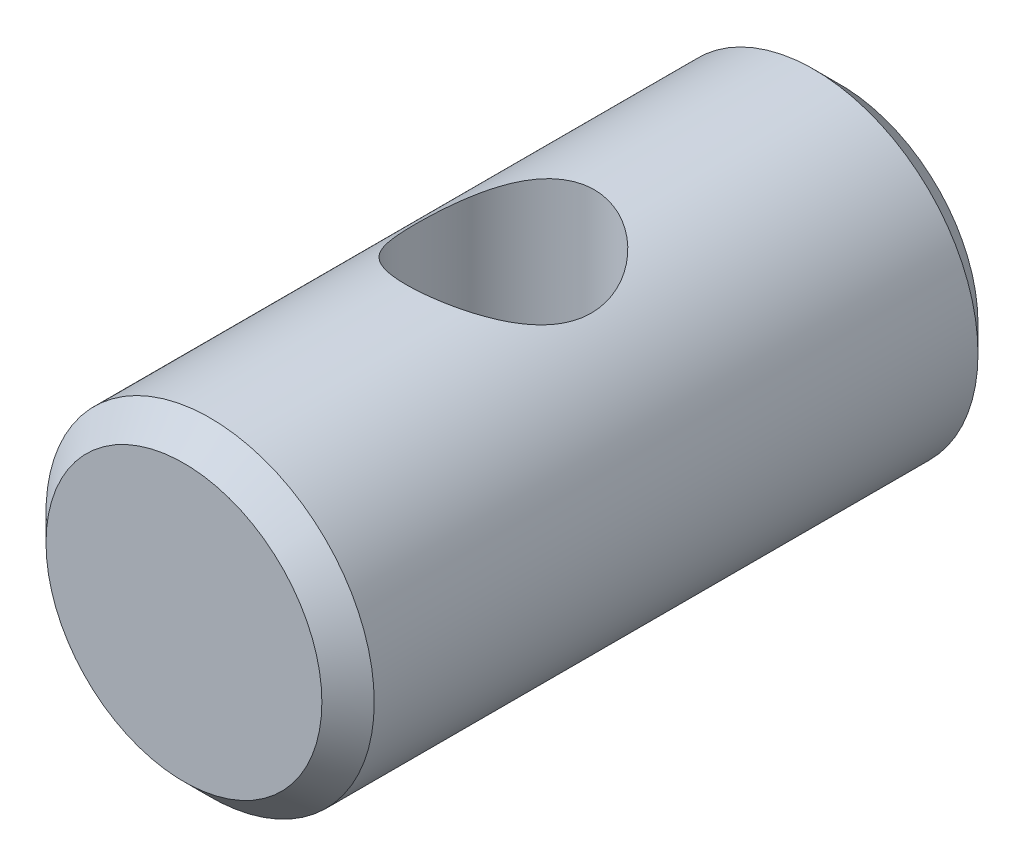
ISO-10303-21;
HEADER;
FILE_DESCRIPTION(('STEP AP214'),'2;1');
FILE_NAME('part.step','',(''),(''),'','','');
FILE_SCHEMA(('AUTOMOTIVE_DESIGN { 1 0 10303 214 1 1 1 1 }'));
ENDSEC;
DATA;
#1=APPLICATION_CONTEXT('core data for automotive mechanical design processes');
#2=APPLICATION_PROTOCOL_DEFINITION('international standard','automotive_design',2000,#1);
#3=PRODUCT_CONTEXT('',#1,'mechanical');
#4=PRODUCT('Part','Part','',(#3));
#5=PRODUCT_RELATED_PRODUCT_CATEGORY('part','',(#4));
#6=PRODUCT_DEFINITION_FORMATION('','',#4);
#7=PRODUCT_DEFINITION_CONTEXT('part definition',#1,'design');
#8=PRODUCT_DEFINITION('design','',#6,#7);
#9=PRODUCT_DEFINITION_SHAPE('','',#8);
#10=(LENGTH_UNIT() NAMED_UNIT(*) SI_UNIT(.MILLI.,.METRE.));
#11=(NAMED_UNIT(*) PLANE_ANGLE_UNIT() SI_UNIT($,.RADIAN.));
#12=(NAMED_UNIT(*) SI_UNIT($,.STERADIAN.) SOLID_ANGLE_UNIT());
#13=UNCERTAINTY_MEASURE_WITH_UNIT(LENGTH_MEASURE(1.E-05),#10,'distance_accuracy_value','');
#14=(GEOMETRIC_REPRESENTATION_CONTEXT(3) GLOBAL_UNCERTAINTY_ASSIGNED_CONTEXT((#13)) GLOBAL_UNIT_ASSIGNED_CONTEXT((#10,
#11,#12)) REPRESENTATION_CONTEXT('',''));
#15=CARTESIAN_POINT('',(0.,0.,0.));
#16=DIRECTION('',(0.,0.,1.));
#17=DIRECTION('',(1.,0.,0.));
#18=AXIS2_PLACEMENT_3D('',#15,#16,#17);
#19=CARTESIAN_POINT('',(0.,0.,9.525));
#20=DIRECTION('',(0.,0.,-1.));
#21=DIRECTION('',(-1.,0.,0.));
#22=AXIS2_PLACEMENT_3D('',#19,#20,#21);
#23=CYLINDRICAL_SURFACE('',#22,4.765);
#24=CARTESIAN_POINT('',(0.,-4.765,-2.54273966422046));
#25=CARTESIAN_POINT('',(-0.131234162810196,-4.76499632502414,-2.55563858615669));
#26=CARTESIAN_POINT('',(-0.263508875387824,-4.75952804002792,-2.55833983860571));
#27=CARTESIAN_POINT('',(-0.526026721694798,-4.73771016732301,-2.54345094110737));
#28=CARTESIAN_POINT('',(-0.656268752678808,-4.7213548698996,-2.52585014015741));
#29=CARTESIAN_POINT('',(-0.910558488777227,-4.67896174619539,-2.47154715768307));
#30=CARTESIAN_POINT('',(-1.0346247978077,-4.65295528293233,-2.43490669591046));
#31=CARTESIAN_POINT('',(-1.2741756527519,-4.59314338018976,-2.34425023151949));
#32=CARTESIAN_POINT('',(-1.38965862622015,-4.55933651632967,-2.29023105477541));
#33=CARTESIAN_POINT('',(-1.61667014870217,-4.48405534141557,-2.16291105056823));
#34=CARTESIAN_POINT('',(-1.72754276873011,-4.44224209691054,-2.08864569511591));
#35=CARTESIAN_POINT('',(-1.93579371588697,-4.3555340907485,-1.92450796803898));
#36=CARTESIAN_POINT('',(-2.03315940991598,-4.31063650218239,-1.83462116021945));
#37=CARTESIAN_POINT('',(-2.22384777330615,-4.215730489479,-1.62908413718988));
#38=CARTESIAN_POINT('',(-2.31525852917362,-4.16576041150536,-1.51163299377078));
#39=CARTESIAN_POINT('',(-2.47712992918034,-4.07158824215013,-1.26100138228972));
#40=CARTESIAN_POINT('',(-2.54760693767323,-4.02738166057037,-1.12783331488505));
#41=CARTESIAN_POINT('',(-2.65318474211665,-3.9584088780149,-0.87605484010196));
#42=CARTESIAN_POINT('',(-2.69253260643925,-3.93152513092531,-0.759811434548258));
#43=CARTESIAN_POINT('',(-2.75433251261748,-3.88848511948111,-0.521057643325844));
#44=CARTESIAN_POINT('',(-2.77680672770738,-3.87231478020774,-0.398555708854987));
#45=CARTESIAN_POINT('',(-2.80367066797346,-3.85291481090373,-0.149941913344977));
#46=CARTESIAN_POINT('',(-2.80797623517439,-3.84974540364682,-0.0238159718505973));
#47=CARTESIAN_POINT('',(-2.79797010239369,-3.85702211954356,0.227315359086184));
#48=CARTESIAN_POINT('',(-2.78365330360741,-3.86747197165258,0.352320432197594));
#49=CARTESIAN_POINT('',(-2.73891068281778,-3.89926448698678,0.588964880899587));
#50=CARTESIAN_POINT('',(-2.70963978394585,-3.91982268222749,0.700936430756225));
#51=CARTESIAN_POINT('',(-2.63702474820962,-3.96903518064436,0.918305034517872));
#52=CARTESIAN_POINT('',(-2.59367537128443,-3.99769249782704,1.02369962301395));
#53=CARTESIAN_POINT('',(-2.48804168009262,-4.06438550992604,1.23907885058188));
#54=CARTESIAN_POINT('',(-2.4240754869965,-4.10314362376342,1.34801082677383));
#55=CARTESIAN_POINT('',(-2.28157130333465,-4.18406267879159,1.55451137031308));
#56=CARTESIAN_POINT('',(-2.20302231602904,-4.22622617430036,1.65207127110964));
#57=CARTESIAN_POINT('',(-2.01792763899043,-4.31805508413361,1.85036906609927));
#58=CARTESIAN_POINT('',(-1.90889067692406,-4.36776601787844,1.94877845711763));
#59=CARTESIAN_POINT('',(-1.67433379772052,-4.46294190336347,2.12624630795825));
#60=CARTESIAN_POINT('',(-1.54880911191897,-4.50840562016684,2.20529915036132));
#61=CARTESIAN_POINT('',(-1.28211451393215,-4.59141709314619,2.34210643095331));
#62=CARTESIAN_POINT('',(-1.14077935681848,-4.62886644765454,2.39960198698727));
#63=CARTESIAN_POINT('',(-0.847649194485303,-4.69138312631982,2.48882113504679));
#64=CARTESIAN_POINT('',(-0.69586717545074,-4.71646551765715,2.52057611841751));
#65=CARTESIAN_POINT('',(-0.40617897189008,-4.74961816322524,2.55386882592492));
#66=CARTESIAN_POINT('',(-0.268831766884244,-4.75938713260981,2.558613321697));
#67=CARTESIAN_POINT('',(0.00514878225355242,-4.76696428347758,2.54591939769328));
#68=CARTESIAN_POINT('',(0.14178235351875,-4.764776536239,2.52848853020959));
#69=CARTESIAN_POINT('',(0.400084379431176,-4.7498106063684,2.47418155682139));
#70=CARTESIAN_POINT('',(0.52211998541907,-4.73781091642973,2.4388052135991));
#71=CARTESIAN_POINT('',(0.758670403551588,-4.70573057938552,2.35085924151378));
#72=CARTESIAN_POINT('',(0.873184171932456,-4.68564881351903,2.29828723253035));
#73=CARTESIAN_POINT('',(1.09791688037624,-4.63828244841571,2.17449724800048));
#74=CARTESIAN_POINT('',(1.20761879618655,-4.61068269292564,2.10246495346889));
#75=CARTESIAN_POINT('',(1.41413807750308,-4.55159272957087,1.94311708671047));
#76=CARTESIAN_POINT('',(1.51094792437732,-4.52010027195177,1.85579266426418));
#77=CARTESIAN_POINT('',(1.69928989061669,-4.45293534574244,1.6579535778627));
#78=CARTESIAN_POINT('',(1.78925876685605,-4.41716576274987,1.54597828309691));
#79=CARTESIAN_POINT('',(1.94959707604509,-4.3487829593985,1.30782639571371));
#80=CARTESIAN_POINT('',(2.01995981269805,-4.31617081991098,1.18164497173222));
#81=CARTESIAN_POINT('',(2.14004270510666,-4.2579344769261,0.915134343662928));
#82=CARTESIAN_POINT('',(2.18933842475008,-4.23245722646518,0.774579158295589));
#83=CARTESIAN_POINT('',(2.26285770076865,-4.19362427692555,0.485521517103191));
#84=CARTESIAN_POINT('',(2.28711561200449,-4.18025197152633,0.337030245768311));
#85=CARTESIAN_POINT('',(2.30791655783512,-4.1687950418939,0.0541461069359638));
#86=CARTESIAN_POINT('',(2.30723302883259,-4.16918047029109,-0.079985524621833));
#87=CARTESIAN_POINT('',(2.28498302399738,-4.18141542004355,-0.345967138086162));
#88=CARTESIAN_POINT('',(2.26341531186645,-4.19326562008835,-0.477816984445627));
#89=CARTESIAN_POINT('',(2.20202919035762,-4.22580271307766,-0.729038499438524));
#90=CARTESIAN_POINT('',(2.16315308305691,-4.24603000472168,-0.848705104752036));
#91=CARTESIAN_POINT('',(2.0688807322471,-4.29275151137972,-1.08001363539453));
#92=CARTESIAN_POINT('',(2.01347917760682,-4.31924774060724,-1.19165296649177));
#93=CARTESIAN_POINT('',(1.88122278738037,-4.37858200533904,-1.4158075340892));
#94=CARTESIAN_POINT('',(1.80277105005214,-4.41178981482293,-1.52728234295355));
#95=CARTESIAN_POINT('',(1.62924713419758,-4.47877547679348,-1.73635566067325));
#96=CARTESIAN_POINT('',(1.53416248453246,-4.51255373970693,-1.83394365710203));
#97=CARTESIAN_POINT('',(1.32032828765552,-4.57990821684137,-2.02087476584663));
#98=CARTESIAN_POINT('',(1.20025244925115,-4.6132218068865,-2.10880613438957));
#99=CARTESIAN_POINT('',(0.945299700362144,-4.67211643000784,-2.26305319257858));
#100=CARTESIAN_POINT('',(0.810441721310551,-4.6977071995246,-2.32939610790794));
#101=CARTESIAN_POINT('',(0.563277855797107,-4.73282391344763,-2.42481780969898));
#102=CARTESIAN_POINT('',(0.453263645921081,-4.74472559578174,-2.45901026584623));
#103=CARTESIAN_POINT('',(0.229098138083577,-4.76081396835667,-2.51231959839029));
#104=CARTESIAN_POINT('',(0.114948225900611,-4.76500321891759,-2.53144147660795));
#105=CARTESIAN_POINT('',(0.,-4.765,-2.54273966422046));
#106=B_SPLINE_CURVE_WITH_KNOTS('',3,(#24,#25,#26,#27,#28,#29,#30,#31,#32,#33,#34,#35,#36,#37,
#38,#39,#40,#41,#42,#43,#44,#45,#46,#47,#48,#49,#50,#51,#52,#53,#54,#55,#56,#57,#58,#59,#60,#61,
#62,#63,#64,#65,#66,#67,#68,#69,#70,#71,#72,#73,#74,#75,#76,#77,#78,#79,#80,#81,#82,#83,#84,#85,
#86,#87,#88,#89,#90,#91,#92,#93,#94,#95,#96,#97,#98,#99,#100,#101,#102,#103,#104,#105),
.UNSPECIFIED.,.T.,.F.,(4,2,2,2,2,2,2,2,2,2,2,2,2,2,2,2,2,2,2,2,2,2,2,2,2,2,2,2,2,2,2,2,2,2,2,2,
2,2,2,2,4),(0.,0.395157201582333,0.790521807573739,1.18461270549849,1.5787756228383,
1.99665296848116,2.41491855921222,2.8837514888849,3.35221695150818,3.72757502529394,
4.10243898307969,4.47903743408369,4.85573901946876,5.20696453809481,5.55832093425036,
5.95326642093885,6.3485109507995,6.81159304852363,7.27480937737291,7.74342270684961,
8.21146368587793,8.62255134643365,9.0334990398063,9.4146836640201,9.7959210718542,
10.1966048733205,10.597521338961,11.0396141399718,11.4818577491538,11.9326333445016,
12.3827895963696,12.7830597956375,13.1833536914802,13.5641072309905,13.9449832733797,
14.3641527387697,14.7836378496742,15.2388780061927,15.6935418038538,16.0397756283396,
16.3858944917596),.UNSPECIFIED.);
#107=CARTESIAN_POINT('',(0.,-4.765,-2.54273966422046));
#108=VERTEX_POINT('',#107);
#109=EDGE_CURVE('E10',#108,#108,#106,.T.);
#110=ORIENTED_EDGE('',*,*,#109,.T.);
#111=EDGE_LOOP('',(#110));
#112=FACE_BOUND('',#111,.T.);
#113=CARTESIAN_POINT('',(-0.25,4.75843724346555,2.555));
#114=CARTESIAN_POINT('',(-0.385163678780842,4.75132815440107,2.55499107810838));
#115=CARTESIAN_POINT('',(-0.520100292608079,4.73841314389739,2.54421556236934));
#116=CARTESIAN_POINT('',(-0.785218796075806,4.70176917511246,2.50192764555904));
#117=CARTESIAN_POINT('',(-0.91539525011664,4.67802824718638,2.47039227424551));
#118=CARTESIAN_POINT('',(-1.16689800132245,4.62170051578524,2.38846030241938));
#119=CARTESIAN_POINT('',(-1.28826121868751,4.58915368183242,2.33814854468838));
#120=CARTESIAN_POINT('',(-1.52034729250968,4.51758109161807,2.22062615301127));
#121=CARTESIAN_POINT('',(-1.6310694645891,4.47855491907827,2.15341443314991));
#122=CARTESIAN_POINT('',(-1.84857626468917,4.39348232533368,1.99796087049715));
#123=CARTESIAN_POINT('',(-1.95434531488107,4.34712434613272,1.90847060875874));
#124=CARTESIAN_POINT('',(-2.15007688106107,4.25372552395639,1.71371667007873));
#125=CARTESIAN_POINT('',(-2.24002002882504,4.20668391948268,1.60843395362513));
#126=CARTESIAN_POINT('',(-2.41002916590341,4.11185060566936,1.37306962283389));
#127=CARTESIAN_POINT('',(-2.48836639091998,4.06440573109536,1.24158615385677));
#128=CARTESIAN_POINT('',(-2.62112534537658,3.98009512243306,0.964017245381053));
#129=CARTESIAN_POINT('',(-2.67559528803826,3.94320811366945,0.817961981750011));
#130=CARTESIAN_POINT('',(-2.74712114513963,3.8935770325071,0.553352767753684));
#131=CARTESIAN_POINT('',(-2.77013829389853,3.87709589894398,0.4371066125974));
#132=CARTESIAN_POINT('',(-2.79979628677565,3.85573855720654,0.201535239654407));
#133=CARTESIAN_POINT('',(-2.80645353788804,3.85085072253029,0.0822132280687742));
#134=CARTESIAN_POINT('',(-2.80301169802563,3.8533559051559,-0.156139009296479));
#135=CARTESIAN_POINT('',(-2.79289960923774,3.86075844866014,-0.275168937056792));
#136=CARTESIAN_POINT('',(-2.75649903016945,3.88682664054962,-0.509479652925296));
#137=CARTESIAN_POINT('',(-2.73019872908207,3.9055005122245,-0.62475763892877));
#138=CARTESIAN_POINT('',(-2.66238858646861,3.95203738689983,-0.849925651819024));
#139=CARTESIAN_POINT('',(-2.62073972799614,3.97998413937587,-0.959755680646419));
#140=CARTESIAN_POINT('',(-2.52372518764665,4.04219640833712,-1.17121725697825));
#141=CARTESIAN_POINT('',(-2.46835421176854,4.07646436223806,-1.27284562016779));
#142=CARTESIAN_POINT('',(-2.33450091510857,4.1547949430229,-1.48358878119539));
#143=CARTESIAN_POINT('',(-2.25367952295343,4.19952746672167,-1.59097093081522));
#144=CARTESIAN_POINT('',(-2.07645536524904,4.28992669084867,-1.79165626862038));
#145=CARTESIAN_POINT('',(-1.98003889802273,4.33559418162866,-1.88494693549862));
#146=CARTESIAN_POINT('',(-1.76004819842251,4.42984028172621,-2.06653550292573));
#147=CARTESIAN_POINT('',(-1.63458566614855,4.47806898496525,-2.15275083760529));
#148=CARTESIAN_POINT('',(-1.36815138169282,4.56651338586753,-2.30240430081724));
#149=CARTESIAN_POINT('',(-1.22718731199266,4.60673302524853,-2.36585364618381));
#150=CARTESIAN_POINT('',(-0.942123288385633,4.67308768666606,-2.46380350182508));
#151=CARTESIAN_POINT('',(-0.798702609092035,4.69991537547855,-2.49979498555525));
#152=CARTESIAN_POINT('',(-0.506028364688864,4.74034824594449,-2.54644204603313));
#153=CARTESIAN_POINT('',(-0.356780966365049,4.75396703283935,-2.55712370843977));
#154=CARTESIAN_POINT('',(-0.0764474868560791,4.7661974653319,-2.55247178199058));
#155=CARTESIAN_POINT('',(0.0546278595494089,4.76644048319493,-2.54015948640945));
#156=CARTESIAN_POINT('',(0.312931961746641,4.75646872463523,-2.49565623274721));
#157=CARTESIAN_POINT('',(0.440160905397018,4.74625445979933,-2.46346624714472));
#158=CARTESIAN_POINT('',(0.684385969992195,4.71716464673776,-2.38142338387459));
#159=CARTESIAN_POINT('',(0.801549808437068,4.69849301814513,-2.33199232791512));
#160=CARTESIAN_POINT('',(1.02630005087947,4.65457412053063,-2.21698723226995));
#161=CARTESIAN_POINT('',(1.13388404199172,4.62932520113105,-2.15140914118717));
#162=CARTESIAN_POINT('',(1.34619991250657,4.57231396943699,-1.99965242046587));
#163=CARTESIAN_POINT('',(1.44992135392871,4.54018142482717,-1.91220072046836));
#164=CARTESIAN_POINT('',(1.6420781640847,4.4742757975371,-1.72230605395647));
#165=CARTESIAN_POINT('',(1.73050169307766,4.44050146987312,-1.61985158835253));
#166=CARTESIAN_POINT('',(1.89735373007888,4.37196824964035,-1.39229843727618));
#167=CARTESIAN_POINT('',(1.9742324510914,4.33738145008951,-1.26600312779019));
#168=CARTESIAN_POINT('',(2.1055504668703,4.27518328570193,-1.0006438350074));
#169=CARTESIAN_POINT('',(2.16000122311163,4.247568360793,-0.861586418134974));
#170=CARTESIAN_POINT('',(2.242363306459,4.20465547917407,-0.580274042309232));
#171=CARTESIAN_POINT('',(2.27127480166438,4.18889731575713,-0.438386312693482));
#172=CARTESIAN_POINT('',(2.30462408374796,4.17065107626049,-0.150978255088792));
#173=CARTESIAN_POINT('',(2.30908597585027,4.16814992997183,-0.00546164714591567));
#174=CARTESIAN_POINT('',(2.29423215480088,4.17633170429811,0.267201921180094));
#175=CARTESIAN_POINT('',(2.27757161074944,4.1855427557727,0.394550253454086));
#176=CARTESIAN_POINT('',(2.22570709769923,4.21334888942343,0.644344432932047));
#177=CARTESIAN_POINT('',(2.19049727846762,4.23194693207339,0.766788720338352));
#178=CARTESIAN_POINT('',(2.1021333683059,4.27653249292732,1.00600476316991));
#179=CARTESIAN_POINT('',(2.04867959363697,4.30264219645175,1.12264186432631));
#180=CARTESIAN_POINT('',(1.925532582045,4.35914385371744,1.34586485476259));
#181=CARTESIAN_POINT('',(1.85583222482408,4.3895376827228,1.45244630815674));
#182=CARTESIAN_POINT('',(1.69241948424028,4.45528583398062,1.66588388253293));
#183=CARTESIAN_POINT('',(1.59683732972855,4.49080024144599,1.77126552680872));
#184=CARTESIAN_POINT('',(1.3890253731465,4.55936682725082,1.9651580631937));
#185=CARTESIAN_POINT('',(1.27678650246721,4.59241764949374,2.05365970476791));
#186=CARTESIAN_POINT('',(1.0337407776558,4.65325027953944,2.21401588649555));
#187=CARTESIAN_POINT('',(0.90243702698125,4.68081792181469,2.28521173157086));
#188=CARTESIAN_POINT('',(0.696811175330855,4.71429046964858,2.37427297769911));
#189=CARTESIAN_POINT('',(0.626844251031563,4.72413323767171,2.40099981369809));
#190=CARTESIAN_POINT('',(0.484522717805594,4.74084238127694,2.44828843272349));
#191=CARTESIAN_POINT('',(0.412168991277147,4.74770984384486,2.46885246639484));
#192=CARTESIAN_POINT('',(0.242715779170991,4.75978964663535,2.50898763889102));
#193=CARTESIAN_POINT('',(0.144965224229935,4.76380941765858,2.52622936381724));
#194=CARTESIAN_POINT('',(-0.0518975851406556,4.76573613343574,2.54923817842044));
#195=CARTESIAN_POINT('',(-0.15100968811096,4.76364375271484,2.55500653415801));
#196=CARTESIAN_POINT('',(-0.25,4.75843724346555,2.555));
#197=B_SPLINE_CURVE_WITH_KNOTS('',3,(#113,#114,#115,#116,#117,#118,#119,#120,#121,#122,#123,
#124,#125,#126,#127,#128,#129,#130,#131,#132,#133,#134,#135,#136,#137,#138,#139,#140,#141,#142,
#143,#144,#145,#146,#147,#148,#149,#150,#151,#152,#153,#154,#155,#156,#157,#158,#159,#160,#161,
#162,#163,#164,#165,#166,#167,#168,#169,#170,#171,#172,#173,#174,#175,#176,#177,#178,#179,#180,
#181,#182,#183,#184,#185,#186,#187,#188,#189,#190,#191,#192,#193,#194,#195,#196),.UNSPECIFIED.,
.T.,.F.,(4,2,2,2,2,2,2,2,2,2,2,2,2,2,2,2,2,2,2,2,2,2,2,2,2,2,2,2,2,2,2,2,2,2,2,2,2,2,2,2,2,4),
(0.,0.405664771296216,0.81177915629405,1.21608026820648,1.62040736532431,2.05693007115103,
2.49398334625927,2.97221050816691,3.44946712052865,3.80683866487734,4.1638516623591,
4.52114150779391,4.87869233890995,5.23956457774922,5.60057625864711,6.02386218235867,
6.44752204136459,6.92415140233922,7.40054560385514,7.8487468346166,8.29648592384358,
8.68947806341971,9.08245097811709,9.46641535259534,9.85047616460137,10.2670130773528,
10.6838709384171,11.1371748856882,11.5902468905015,12.0246693689763,12.4586634667604,
12.8431343975013,13.2277266587077,13.6189674405838,14.0103800128171,14.4483373207501,
14.8865339516062,15.3394430821026,15.5657754390946,15.7920250388877,16.0891560030065,
16.3862541775695),.UNSPECIFIED.);
#198=CARTESIAN_POINT('',(-0.25,4.75843724346555,2.555));
#199=VERTEX_POINT('',#198);
#200=EDGE_CURVE('E56',#199,#199,#197,.T.);
#201=ORIENTED_EDGE('',*,*,#200,.T.);
#202=EDGE_LOOP('',(#201));
#203=FACE_BOUND('',#202,.T.);
#204=CARTESIAN_POINT('',(0.,0.,-8.76499999999999));
#205=DIRECTION('',(0.,0.,1.));
#206=DIRECTION('',(1.,0.,0.));
#207=AXIS2_PLACEMENT_3D('',#204,#205,#206);
#208=CIRCLE('',#207,4.765);
#209=CARTESIAN_POINT('',(4.765,0.,-8.76499999999999));
#210=VERTEX_POINT('',#209);
#211=EDGE_CURVE('E99',#210,#210,#208,.T.);
#212=ORIENTED_EDGE('',*,*,#211,.T.);
#213=EDGE_LOOP('',(#212));
#214=FACE_BOUND('',#213,.T.);
#215=CARTESIAN_POINT('',(0.,0.,8.76500000000001));
#216=DIRECTION('',(0.,0.,1.));
#217=DIRECTION('',(1.,0.,0.));
#218=AXIS2_PLACEMENT_3D('',#215,#216,#217);
#219=CIRCLE('',#218,4.765);
#220=CARTESIAN_POINT('',(4.765,0.,8.76500000000001));
#221=VERTEX_POINT('',#220);
#222=EDGE_CURVE('E102',#221,#221,#219,.F.);
#223=ORIENTED_EDGE('',*,*,#222,.T.);
#224=EDGE_LOOP('',(#223));
#225=FACE_BOUND('',#224,.T.);
#226=ADVANCED_FACE('F42',(#112,#203,#214,#225),#23,.T.);
#227=CARTESIAN_POINT('',(0.,0.,9.525));
#228=DIRECTION('',(0.,0.,1.));
#229=DIRECTION('',(1.,0.,0.));
#230=AXIS2_PLACEMENT_3D('',#227,#228,#229);
#231=PLANE('',#230);
#232=CARTESIAN_POINT('',(0.,0.,9.525));
#233=DIRECTION('',(0.,0.,1.));
#234=DIRECTION('',(1.,0.,0.));
#235=AXIS2_PLACEMENT_3D('',#232,#233,#234);
#236=CIRCLE('',#235,4.00500000000001);
#237=CARTESIAN_POINT('',(4.00500000000001,0.,9.525));
#238=VERTEX_POINT('',#237);
#239=EDGE_CURVE('E61',#238,#238,#236,.T.);
#240=ORIENTED_EDGE('',*,*,#239,.T.);
#241=EDGE_LOOP('',(#240));
#242=FACE_BOUND('',#241,.T.);
#243=ADVANCED_FACE('F79',(#242),#231,.T.);
#244=CARTESIAN_POINT('',(0.,0.,-9.525));
#245=DIRECTION('',(0.,0.,1.));
#246=DIRECTION('',(1.,0.,0.));
#247=AXIS2_PLACEMENT_3D('',#244,#245,#246);
#248=PLANE('',#247);
#249=CARTESIAN_POINT('',(0.,0.,-9.525));
#250=DIRECTION('',(0.,0.,1.));
#251=DIRECTION('',(1.,0.,0.));
#252=AXIS2_PLACEMENT_3D('',#249,#250,#251);
#253=CIRCLE('',#252,4.00499999999998);
#254=CARTESIAN_POINT('',(4.00499999999998,0.,-9.525));
#255=VERTEX_POINT('',#254);
#256=EDGE_CURVE('E66',#255,#255,#253,.F.);
#257=ORIENTED_EDGE('',*,*,#256,.T.);
#258=EDGE_LOOP('',(#257));
#259=FACE_BOUND('',#258,.T.);
#260=ADVANCED_FACE('F82',(#259),#248,.F.);
#261=CARTESIAN_POINT('',(0.,0.,-8.76499999999999));
#262=DIRECTION('',(0.,0.,1.));
#263=DIRECTION('',(1.,0.,0.));
#264=AXIS2_PLACEMENT_3D('',#261,#262,#263);
#265=CONICAL_SURFACE('',#264,4.765,0.785398163397451);
#266=ORIENTED_EDGE('',*,*,#256,.F.);
#267=EDGE_LOOP('',(#266));
#268=FACE_BOUND('',#267,.T.);
#269=ORIENTED_EDGE('',*,*,#211,.F.);
#270=EDGE_LOOP('',(#269));
#271=FACE_BOUND('',#270,.T.);
#272=ADVANCED_FACE('F85',(#268,#271),#265,.T.);
#273=CARTESIAN_POINT('',(0.,0.,9.525));
#274=DIRECTION('',(0.,0.,-1.));
#275=DIRECTION('',(-1.,0.,0.));
#276=AXIS2_PLACEMENT_3D('',#273,#274,#275);
#277=CONICAL_SURFACE('',#276,4.00500000000001,0.785398163397448);
#278=ORIENTED_EDGE('',*,*,#222,.F.);
#279=EDGE_LOOP('',(#278));
#280=FACE_BOUND('',#279,.T.);
#281=ORIENTED_EDGE('',*,*,#239,.F.);
#282=EDGE_LOOP('',(#281));
#283=FACE_BOUND('',#282,.T.);
#284=ADVANCED_FACE('F45',(#280,#283),#277,.T.);
#285=CARTESIAN_POINT('',(-0.25,-4.765,0.));
#286=DIRECTION('',(0.,1.,0.));
#287=DIRECTION('',(0.,0.,1.));
#288=AXIS2_PLACEMENT_3D('',#285,#286,#287);
#289=CYLINDRICAL_SURFACE('',#288,2.555);
#290=ORIENTED_EDGE('',*,*,#200,.F.);
#291=EDGE_LOOP('',(#290));
#292=FACE_BOUND('',#291,.T.);
#293=ORIENTED_EDGE('',*,*,#109,.F.);
#294=EDGE_LOOP('',(#293));
#295=FACE_BOUND('',#294,.T.);
#296=ADVANCED_FACE('F74',(#292,#295),#289,.F.);
#297=CLOSED_SHELL('',(#226,#243,#260,#272,#284,#296));
#298=MANIFOLD_SOLID_BREP('B2',#297);
#299=ADVANCED_BREP_SHAPE_REPRESENTATION('',(#18,#298),#14);
#300=SHAPE_DEFINITION_REPRESENTATION(#9,#299);
ENDSEC;
END-ISO-10303-21;
